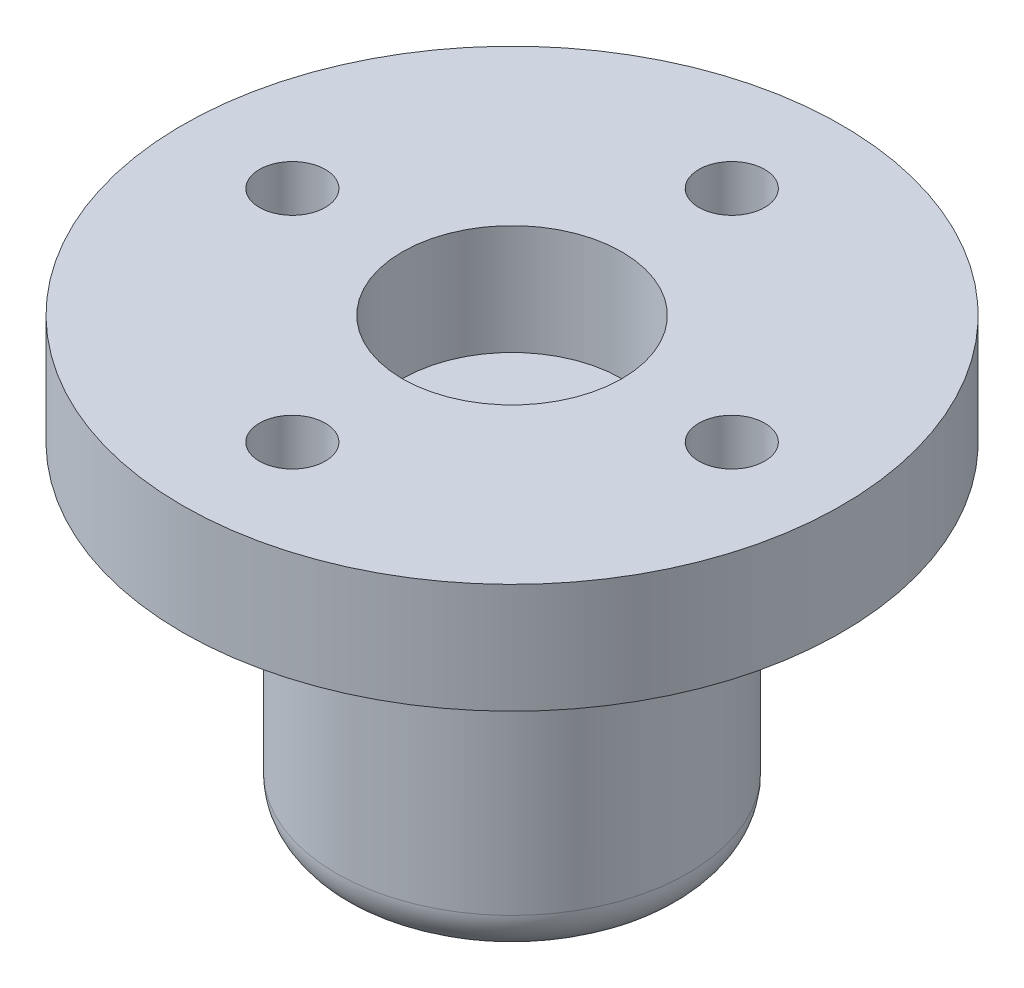
ISO-10303-21;
HEADER;
FILE_DESCRIPTION(('STEP AP214'),'2;1');
FILE_NAME('part.step','',(''),(''),'','','');
FILE_SCHEMA(('AUTOMOTIVE_DESIGN { 1 0 10303 214 1 1 1 1 }'));
ENDSEC;
DATA;
#1=APPLICATION_CONTEXT('core data for automotive mechanical design processes');
#2=APPLICATION_PROTOCOL_DEFINITION('international standard','automotive_design',2000,#1);
#3=PRODUCT_CONTEXT('',#1,'mechanical');
#4=PRODUCT('Part','Part','',(#3));
#5=PRODUCT_RELATED_PRODUCT_CATEGORY('part','',(#4));
#6=PRODUCT_DEFINITION_FORMATION('','',#4);
#7=PRODUCT_DEFINITION_CONTEXT('part definition',#1,'design');
#8=PRODUCT_DEFINITION('design','',#6,#7);
#9=PRODUCT_DEFINITION_SHAPE('','',#8);
#10=(LENGTH_UNIT() NAMED_UNIT(*) SI_UNIT(.MILLI.,.METRE.));
#11=(NAMED_UNIT(*) PLANE_ANGLE_UNIT() SI_UNIT($,.RADIAN.));
#12=(NAMED_UNIT(*) SI_UNIT($,.STERADIAN.) SOLID_ANGLE_UNIT());
#13=UNCERTAINTY_MEASURE_WITH_UNIT(LENGTH_MEASURE(1.E-05),#10,'distance_accuracy_value','');
#14=(GEOMETRIC_REPRESENTATION_CONTEXT(3) GLOBAL_UNCERTAINTY_ASSIGNED_CONTEXT((#13)) GLOBAL_UNIT_ASSIGNED_CONTEXT((#10,
#11,#12)) REPRESENTATION_CONTEXT('',''));
#15=CARTESIAN_POINT('',(0.,0.,0.));
#16=DIRECTION('',(0.,0.,1.));
#17=DIRECTION('',(1.,0.,0.));
#18=AXIS2_PLACEMENT_3D('',#15,#16,#17);
#19=CARTESIAN_POINT('',(0.,-6.35,0.));
#20=DIRECTION('',(0.,1.,0.));
#21=DIRECTION('',(0.,0.,1.));
#22=AXIS2_PLACEMENT_3D('',#19,#20,#21);
#23=CYLINDRICAL_SURFACE('',#22,19.05);
#24=CARTESIAN_POINT('',(0.,-6.35,0.));
#25=DIRECTION('',(0.,1.,0.));
#26=DIRECTION('',(0.,0.,1.));
#27=AXIS2_PLACEMENT_3D('',#24,#25,#26);
#28=CIRCLE('',#27,19.05);
#29=CARTESIAN_POINT('',(0.,-6.35,19.05));
#30=VERTEX_POINT('',#29);
#31=EDGE_CURVE('E44',#30,#30,#28,.T.);
#32=ORIENTED_EDGE('',*,*,#31,.T.);
#33=EDGE_LOOP('',(#32));
#34=FACE_BOUND('',#33,.T.);
#35=CARTESIAN_POINT('',(0.,0.,0.));
#36=DIRECTION('',(0.,1.,0.));
#37=DIRECTION('',(0.,0.,1.));
#38=AXIS2_PLACEMENT_3D('',#35,#36,#37);
#39=CIRCLE('',#38,19.05);
#40=CARTESIAN_POINT('',(0.,0.,19.05));
#41=VERTEX_POINT('',#40);
#42=EDGE_CURVE('E48',#41,#41,#39,.T.);
#43=ORIENTED_EDGE('',*,*,#42,.F.);
#44=EDGE_LOOP('',(#43));
#45=FACE_BOUND('',#44,.T.);
#46=ADVANCED_FACE('F33',(#34,#45),#23,.T.);
#47=CARTESIAN_POINT('',(0.,-6.35,0.));
#48=DIRECTION('',(0.,1.,0.));
#49=DIRECTION('',(0.,0.,1.));
#50=AXIS2_PLACEMENT_3D('',#47,#48,#49);
#51=PLANE('',#50);
#52=CARTESIAN_POINT('',(0.,-6.35,0.));
#53=DIRECTION('',(0.,1.,0.));
#54=DIRECTION('',(0.,0.,1.));
#55=AXIS2_PLACEMENT_3D('',#52,#53,#54);
#56=CIRCLE('',#55,10.16);
#57=CARTESIAN_POINT('',(0.,-6.35,10.16));
#58=VERTEX_POINT('',#57);
#59=EDGE_CURVE('E40',#58,#58,#56,.F.);
#60=ORIENTED_EDGE('',*,*,#59,.F.);
#61=EDGE_LOOP('',(#60));
#62=FACE_BOUND('',#61,.T.);
#63=CARTESIAN_POINT('',(-12.6999999999996,-6.35,3.60178059048672E-13));
#64=DIRECTION('',(0.,1.,0.));
#65=DIRECTION('',(0.,0.,1.));
#66=AXIS2_PLACEMENT_3D('',#63,#64,#65);
#67=CIRCLE('',#66,1.90500000000058);
#68=CARTESIAN_POINT('',(-12.6999999999996,-6.35,1.90500000000094));
#69=VERTEX_POINT('',#68);
#70=EDGE_CURVE('E75',#69,#69,#67,.T.);
#71=ORIENTED_EDGE('',*,*,#70,.T.);
#72=EDGE_LOOP('',(#71));
#73=FACE_BOUND('',#72,.T.);
#74=CARTESIAN_POINT('',(7.1724551522751E-13,-6.35,12.7));
#75=DIRECTION('',(0.,1.,0.));
#76=DIRECTION('',(0.,0.,1.));
#77=AXIS2_PLACEMENT_3D('',#74,#75,#76);
#78=CIRCLE('',#77,1.90500000000077);
#79=CARTESIAN_POINT('',(7.1724551522751E-13,-6.35,14.6050000000008));
#80=VERTEX_POINT('',#79);
#81=EDGE_CURVE('E69',#80,#80,#78,.T.);
#82=ORIENTED_EDGE('',*,*,#81,.T.);
#83=EDGE_LOOP('',(#82));
#84=FACE_BOUND('',#83,.T.);
#85=CARTESIAN_POINT('',(12.7000000000004,-6.35,-3.58622757613755E-13));
#86=DIRECTION('',(0.,1.,0.));
#87=DIRECTION('',(0.,0.,1.));
#88=AXIS2_PLACEMENT_3D('',#85,#86,#87);
#89=CIRCLE('',#88,1.90500000000028);
#90=CARTESIAN_POINT('',(12.7000000000004,-6.35,1.90499999999992));
#91=VERTEX_POINT('',#90);
#92=EDGE_CURVE('E63',#91,#91,#89,.T.);
#93=ORIENTED_EDGE('',*,*,#92,.T.);
#94=EDGE_LOOP('',(#93));
#95=FACE_BOUND('',#94,.T.);
#96=CARTESIAN_POINT('',(0.,-6.35,-12.7));
#97=DIRECTION('',(0.,1.,0.));
#98=DIRECTION('',(0.,0.,1.));
#99=AXIS2_PLACEMENT_3D('',#96,#97,#98);
#100=CIRCLE('',#99,1.905);
#101=CARTESIAN_POINT('',(0.,-6.35,-10.795));
#102=VERTEX_POINT('',#101);
#103=EDGE_CURVE('E57',#102,#102,#100,.T.);
#104=ORIENTED_EDGE('',*,*,#103,.T.);
#105=EDGE_LOOP('',(#104));
#106=FACE_BOUND('',#105,.T.);
#107=ORIENTED_EDGE('',*,*,#31,.F.);
#108=EDGE_LOOP('',(#107));
#109=FACE_BOUND('',#108,.T.);
#110=ADVANCED_FACE('F100',(#62,#73,#84,#95,#106,#109),#51,.F.);
#111=CARTESIAN_POINT('',(0.,0.,0.));
#112=DIRECTION('',(0.,1.,0.));
#113=DIRECTION('',(0.,0.,1.));
#114=AXIS2_PLACEMENT_3D('',#111,#112,#113);
#115=PLANE('',#114);
#116=CARTESIAN_POINT('',(-12.6999999999996,0.,3.60178059048672E-13));
#117=DIRECTION('',(0.,1.,0.));
#118=DIRECTION('',(0.,0.,1.));
#119=AXIS2_PLACEMENT_3D('',#116,#117,#118);
#120=CIRCLE('',#119,1.90500000000058);
#121=CARTESIAN_POINT('',(-12.6999999999996,0.,1.90500000000094));
#122=VERTEX_POINT('',#121);
#123=EDGE_CURVE('E78',#122,#122,#120,.T.);
#124=ORIENTED_EDGE('',*,*,#123,.F.);
#125=EDGE_LOOP('',(#124));
#126=FACE_BOUND('',#125,.T.);
#127=CARTESIAN_POINT('',(7.1724551522751E-13,0.,12.7));
#128=DIRECTION('',(0.,1.,0.));
#129=DIRECTION('',(0.,0.,1.));
#130=AXIS2_PLACEMENT_3D('',#127,#128,#129);
#131=CIRCLE('',#130,1.90500000000077);
#132=CARTESIAN_POINT('',(7.1724551522751E-13,0.,14.6050000000008));
#133=VERTEX_POINT('',#132);
#134=EDGE_CURVE('E72',#133,#133,#131,.T.);
#135=ORIENTED_EDGE('',*,*,#134,.F.);
#136=EDGE_LOOP('',(#135));
#137=FACE_BOUND('',#136,.T.);
#138=CARTESIAN_POINT('',(12.7000000000004,0.,-3.58622757613755E-13));
#139=DIRECTION('',(0.,1.,0.));
#140=DIRECTION('',(0.,0.,1.));
#141=AXIS2_PLACEMENT_3D('',#138,#139,#140);
#142=CIRCLE('',#141,1.90500000000028);
#143=CARTESIAN_POINT('',(12.7000000000004,0.,1.90499999999992));
#144=VERTEX_POINT('',#143);
#145=EDGE_CURVE('E66',#144,#144,#142,.T.);
#146=ORIENTED_EDGE('',*,*,#145,.F.);
#147=EDGE_LOOP('',(#146));
#148=FACE_BOUND('',#147,.T.);
#149=CARTESIAN_POINT('',(0.,0.,-12.7));
#150=DIRECTION('',(0.,1.,0.));
#151=DIRECTION('',(0.,0.,1.));
#152=AXIS2_PLACEMENT_3D('',#149,#150,#151);
#153=CIRCLE('',#152,1.905);
#154=CARTESIAN_POINT('',(0.,0.,-10.795));
#155=VERTEX_POINT('',#154);
#156=EDGE_CURVE('E60',#155,#155,#153,.T.);
#157=ORIENTED_EDGE('',*,*,#156,.F.);
#158=EDGE_LOOP('',(#157));
#159=FACE_BOUND('',#158,.T.);
#160=CARTESIAN_POINT('',(0.,0.,0.));
#161=DIRECTION('',(0.,1.,0.));
#162=DIRECTION('',(0.,0.,1.));
#163=AXIS2_PLACEMENT_3D('',#160,#161,#162);
#164=CIRCLE('',#163,6.35);
#165=CARTESIAN_POINT('',(0.,0.,6.35));
#166=VERTEX_POINT('',#165);
#167=EDGE_CURVE('E54',#166,#166,#164,.T.);
#168=ORIENTED_EDGE('',*,*,#167,.F.);
#169=EDGE_LOOP('',(#168));
#170=FACE_BOUND('',#169,.T.);
#171=ORIENTED_EDGE('',*,*,#42,.T.);
#172=EDGE_LOOP('',(#171));
#173=FACE_BOUND('',#172,.T.);
#174=ADVANCED_FACE('F105',(#126,#137,#148,#159,#170,#173),#115,.T.);
#175=CARTESIAN_POINT('',(0.,-6.35,0.));
#176=DIRECTION('',(0.,1.,0.));
#177=DIRECTION('',(0.,0.,1.));
#178=AXIS2_PLACEMENT_3D('',#175,#176,#177);
#179=CYLINDRICAL_SURFACE('',#178,6.35);
#180=CARTESIAN_POINT('',(0.,-6.35,0.));
#181=DIRECTION('',(0.,1.,0.));
#182=DIRECTION('',(0.,0.,1.));
#183=AXIS2_PLACEMENT_3D('',#180,#181,#182);
#184=CIRCLE('',#183,6.35);
#185=CARTESIAN_POINT('',(0.,-6.35,6.35));
#186=VERTEX_POINT('',#185);
#187=EDGE_CURVE('E52',#186,#186,#184,.T.);
#188=ORIENTED_EDGE('',*,*,#187,.F.);
#189=EDGE_LOOP('',(#188));
#190=FACE_BOUND('',#189,.T.);
#191=ORIENTED_EDGE('',*,*,#167,.T.);
#192=EDGE_LOOP('',(#191));
#193=FACE_BOUND('',#192,.T.);
#194=ADVANCED_FACE('F111',(#190,#193),#179,.F.);
#195=CARTESIAN_POINT('',(0.,-6.35,-12.7));
#196=DIRECTION('',(0.,1.,0.));
#197=DIRECTION('',(0.,0.,1.));
#198=AXIS2_PLACEMENT_3D('',#195,#196,#197);
#199=CYLINDRICAL_SURFACE('',#198,1.905);
#200=ORIENTED_EDGE('',*,*,#103,.F.);
#201=EDGE_LOOP('',(#200));
#202=FACE_BOUND('',#201,.T.);
#203=ORIENTED_EDGE('',*,*,#156,.T.);
#204=EDGE_LOOP('',(#203));
#205=FACE_BOUND('',#204,.T.);
#206=ADVANCED_FACE('F116',(#202,#205),#199,.F.);
#207=CARTESIAN_POINT('',(12.7000000000004,-6.35,-3.58622757613755E-13));
#208=DIRECTION('',(0.,1.,0.));
#209=DIRECTION('',(0.,0.,1.));
#210=AXIS2_PLACEMENT_3D('',#207,#208,#209);
#211=CYLINDRICAL_SURFACE('',#210,1.90500000000028);
#212=ORIENTED_EDGE('',*,*,#92,.F.);
#213=EDGE_LOOP('',(#212));
#214=FACE_BOUND('',#213,.T.);
#215=ORIENTED_EDGE('',*,*,#145,.T.);
#216=EDGE_LOOP('',(#215));
#217=FACE_BOUND('',#216,.T.);
#218=ADVANCED_FACE('F120',(#214,#217),#211,.F.);
#219=CARTESIAN_POINT('',(7.1724551522751E-13,-6.35,12.7));
#220=DIRECTION('',(0.,1.,0.));
#221=DIRECTION('',(0.,0.,1.));
#222=AXIS2_PLACEMENT_3D('',#219,#220,#221);
#223=CYLINDRICAL_SURFACE('',#222,1.90500000000077);
#224=ORIENTED_EDGE('',*,*,#81,.F.);
#225=EDGE_LOOP('',(#224));
#226=FACE_BOUND('',#225,.T.);
#227=ORIENTED_EDGE('',*,*,#134,.T.);
#228=EDGE_LOOP('',(#227));
#229=FACE_BOUND('',#228,.T.);
#230=ADVANCED_FACE('F124',(#226,#229),#223,.F.);
#231=CARTESIAN_POINT('',(-12.6999999999996,-6.35,3.60178059048672E-13));
#232=DIRECTION('',(0.,1.,0.));
#233=DIRECTION('',(0.,0.,1.));
#234=AXIS2_PLACEMENT_3D('',#231,#232,#233);
#235=CYLINDRICAL_SURFACE('',#234,1.90500000000058);
#236=ORIENTED_EDGE('',*,*,#70,.F.);
#237=EDGE_LOOP('',(#236));
#238=FACE_BOUND('',#237,.T.);
#239=ORIENTED_EDGE('',*,*,#123,.T.);
#240=EDGE_LOOP('',(#239));
#241=FACE_BOUND('',#240,.T.);
#242=ADVANCED_FACE('F128',(#238,#241),#235,.F.);
#243=CARTESIAN_POINT('',(0.,-6.35,0.));
#244=DIRECTION('',(0.,-1.,0.));
#245=DIRECTION('',(0.,0.,-1.));
#246=AXIS2_PLACEMENT_3D('',#243,#244,#245);
#247=PLANE('',#246);
#248=ORIENTED_EDGE('',*,*,#187,.T.);
#249=EDGE_LOOP('',(#248));
#250=FACE_BOUND('',#249,.T.);
#251=ADVANCED_FACE('F97',(#250),#247,.F.);
#252=CARTESIAN_POINT('',(0.,-25.4,0.));
#253=DIRECTION('',(0.,1.,0.));
#254=DIRECTION('',(0.,0.,1.));
#255=AXIS2_PLACEMENT_3D('',#252,#253,#254);
#256=CYLINDRICAL_SURFACE('',#255,10.16);
#257=CARTESIAN_POINT('',(0.,-22.86,0.));
#258=DIRECTION('',(0.,-1.,0.));
#259=DIRECTION('',(0.,0.,-1.));
#260=AXIS2_PLACEMENT_3D('',#257,#258,#259);
#261=CIRCLE('',#260,10.16);
#262=CARTESIAN_POINT('',(0.,-22.86,-10.16));
#263=VERTEX_POINT('',#262);
#264=EDGE_CURVE('E10',#263,#263,#261,.F.);
#265=ORIENTED_EDGE('',*,*,#264,.T.);
#266=EDGE_LOOP('',(#265));
#267=FACE_BOUND('',#266,.T.);
#268=ORIENTED_EDGE('',*,*,#59,.T.);
#269=EDGE_LOOP('',(#268));
#270=FACE_BOUND('',#269,.T.);
#271=ADVANCED_FACE('F90',(#267,#270),#256,.T.);
#272=CARTESIAN_POINT('',(0.,-22.86,0.));
#273=DIRECTION('',(0.,-1.,0.));
#274=DIRECTION('',(0.,0.,-1.));
#275=AXIS2_PLACEMENT_3D('',#272,#273,#274);
#276=TOROIDAL_SURFACE('',#275,7.62,2.54);
#277=ORIENTED_EDGE('',*,*,#264,.F.);
#278=EDGE_LOOP('',(#277));
#279=FACE_BOUND('',#278,.T.);
#280=CARTESIAN_POINT('',(0.,-25.4,0.));
#281=DIRECTION('',(0.,-1.,0.));
#282=DIRECTION('',(0.,0.,-1.));
#283=AXIS2_PLACEMENT_3D('',#280,#281,#282);
#284=CIRCLE('',#283,7.62);
#285=CARTESIAN_POINT('',(0.,-25.4,-7.62));
#286=VERTEX_POINT('',#285);
#287=EDGE_CURVE('E81',#286,#286,#284,.T.);
#288=ORIENTED_EDGE('',*,*,#287,.F.);
#289=EDGE_LOOP('',(#288));
#290=FACE_BOUND('',#289,.T.);
#291=ADVANCED_FACE('F35',(#279,#290),#276,.T.);
#292=CARTESIAN_POINT('',(0.,-25.4,0.));
#293=DIRECTION('',(0.,0.,-1.));
#294=DIRECTION('',(-1.,0.,0.));
#295=AXIS2_PLACEMENT_3D('',#292,#293,#294);
#296=SPHERICAL_SURFACE('',#295,7.62);
#297=CARTESIAN_POINT('',(0.,-25.4,0.));
#298=DIRECTION('',(0.,-1.,0.));
#299=DIRECTION('',(0.,0.,-1.));
#300=AXIS2_PLACEMENT_3D('',#297,#298,#299);
#301=SPHERICAL_SURFACE('',#300,7.62);
#302=ORIENTED_EDGE('',*,*,#287,.T.);
#303=EDGE_LOOP('',(#302));
#304=FACE_BOUND('',#303,.T.);
#305=ADVANCED_FACE('F87',(#304),#301,.F.);
#306=CLOSED_SHELL('',(#46,#110,#174,#194,#206,#218,#230,#242,#251,#271,#291,#305));
#307=MANIFOLD_SOLID_BREP('B2',#306);
#308=ADVANCED_BREP_SHAPE_REPRESENTATION('',(#18,#307),#14);
#309=SHAPE_DEFINITION_REPRESENTATION(#9,#308);
ENDSEC;
END-ISO-10303-21;
